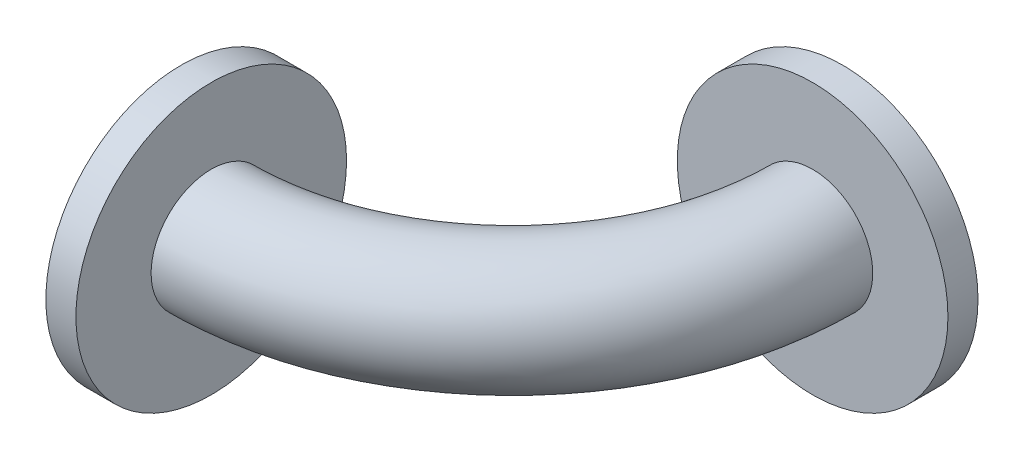
ISO-10303-21;
HEADER;
FILE_DESCRIPTION(('STEP AP214'),'2;1');
FILE_NAME('part.step','',(''),(''),'','','');
FILE_SCHEMA(('AUTOMOTIVE_DESIGN { 1 0 10303 214 1 1 1 1 }'));
ENDSEC;
DATA;
#1=APPLICATION_CONTEXT('core data for automotive mechanical design processes');
#2=APPLICATION_PROTOCOL_DEFINITION('international standard','automotive_design',2000,#1);
#3=PRODUCT_CONTEXT('',#1,'mechanical');
#4=PRODUCT('Part','Part','',(#3));
#5=PRODUCT_RELATED_PRODUCT_CATEGORY('part','',(#4));
#6=PRODUCT_DEFINITION_FORMATION('','',#4);
#7=PRODUCT_DEFINITION_CONTEXT('part definition',#1,'design');
#8=PRODUCT_DEFINITION('design','',#6,#7);
#9=PRODUCT_DEFINITION_SHAPE('','',#8);
#10=(LENGTH_UNIT() NAMED_UNIT(*) SI_UNIT(.MILLI.,.METRE.));
#11=(NAMED_UNIT(*) PLANE_ANGLE_UNIT() SI_UNIT($,.RADIAN.));
#12=(NAMED_UNIT(*) SI_UNIT($,.STERADIAN.) SOLID_ANGLE_UNIT());
#13=UNCERTAINTY_MEASURE_WITH_UNIT(LENGTH_MEASURE(1.E-05),#10,'distance_accuracy_value','');
#14=(GEOMETRIC_REPRESENTATION_CONTEXT(3) GLOBAL_UNCERTAINTY_ASSIGNED_CONTEXT((#13)) GLOBAL_UNIT_ASSIGNED_CONTEXT((#10,
#11,#12)) REPRESENTATION_CONTEXT('',''));
#15=CARTESIAN_POINT('',(0.,0.,0.));
#16=DIRECTION('',(0.,0.,1.));
#17=DIRECTION('',(1.,0.,0.));
#18=AXIS2_PLACEMENT_3D('',#15,#16,#17);
#19=CARTESIAN_POINT('',(40.,0.,0.));
#20=DIRECTION('',(2.45418139062237E-06,0.,0.999999999996989));
#21=DIRECTION('',(0.999999999996989,0.,-2.45418139062237E-06));
#22=AXIS2_PLACEMENT_3D('',#19,#20,#21);
#23=PLANE('',#22);
#24=CARTESIAN_POINT('',(40.,0.,0.));
#25=DIRECTION('',(2.45418139062237E-06,0.,0.999999999996989));
#26=DIRECTION('',(0.999999999996989,0.,-2.45418139062237E-06));
#27=AXIS2_PLACEMENT_3D('',#24,#25,#26);
#28=CIRCLE('',#27,8.);
#29=CARTESIAN_POINT('',(40.0000000003982,8.,0.));
#30=VERTEX_POINT('',#29);
#31=CARTESIAN_POINT('',(40.0000000003982,-8.00000000000009,0.));
#32=VERTEX_POINT('',#31);
#33=EDGE_CURVE('E93',#30,#32,#28,.T.);
#34=ORIENTED_EDGE('',*,*,#33,.F.);
#35=DIRECTION('',(0.,-1.,0.));
#36=VECTOR('',#35,1.);
#37=CARTESIAN_POINT('',(40.0000000003982,0.,0.));
#38=LINE('',#37,#36);
#39=EDGE_CURVE('E124',#30,#32,#38,.T.);
#40=ORIENTED_EDGE('',*,*,#39,.T.);
#41=EDGE_LOOP('',(#34,#40));
#42=FACE_BOUND('',#41,.T.);
#43=ADVANCED_FACE('F57',(#42),#23,.F.);
#44=CARTESIAN_POINT('',(0.,0.,40.));
#45=DIRECTION('',(-0.999999999996989,0.,-2.45418138975396E-06));
#46=DIRECTION('',(-2.45418138975396E-06,0.,0.999999999996989));
#47=AXIS2_PLACEMENT_3D('',#44,#45,#46);
#48=PLANE('',#47);
#49=DIRECTION('',(0.,-1.,0.));
#50=VECTOR('',#49,1.);
#51=CARTESIAN_POINT('',(0.,0.,40.0000000115915));
#52=LINE('',#51,#50);
#53=CARTESIAN_POINT('',(0.,8.,40.0000000115915));
#54=VERTEX_POINT('',#53);
#55=CARTESIAN_POINT('',(0.,-8.,40.0000000115915));
#56=VERTEX_POINT('',#55);
#57=EDGE_CURVE('E95',#54,#56,#52,.T.);
#58=ORIENTED_EDGE('',*,*,#57,.F.);
#59=CARTESIAN_POINT('',(0.,0.,40.));
#60=DIRECTION('',(-0.999999999996989,0.,-2.45418138975396E-06));
#61=DIRECTION('',(-2.45418138975396E-06,0.,0.999999999996989));
#62=AXIS2_PLACEMENT_3D('',#59,#60,#61);
#63=CIRCLE('',#62,8.);
#64=EDGE_CURVE('E87',#54,#56,#63,.T.);
#65=ORIENTED_EDGE('',*,*,#64,.T.);
#66=EDGE_LOOP('',(#58,#65));
#67=FACE_BOUND('',#66,.T.);
#68=ADVANCED_FACE('F96',(#67),#48,.T.);
#69=CARTESIAN_POINT('',(9.8167014690731E-05,0.,9.81670147150171E-05));
#70=DIRECTION('',(0.,-1.,0.));
#71=DIRECTION('',(0.,0.,-1.));
#72=AXIS2_PLACEMENT_3D('',#69,#70,#71);
#73=TOROIDAL_SURFACE('',#72,39.9999018331058,8.);
#74=CARTESIAN_POINT('',(0.,-4.87386490187069,33.6560705458997));
#75=CARTESIAN_POINT('',(0.,-5.05210067986452,33.7930021128648));
#76=CARTESIAN_POINT('',(0.,-5.22454037301277,33.93743455006));
#77=CARTESIAN_POINT('',(0.,-5.55670460949417,34.2403509101367));
#78=CARTESIAN_POINT('',(0.,-5.71642579537593,34.3988385201396));
#79=CARTESIAN_POINT('',(0.,-6.02211615547664,34.7288740969469));
#80=CARTESIAN_POINT('',(0.,-6.16807044869761,34.9004358419699));
#81=CARTESIAN_POINT('',(0.,-6.44500070193682,35.2552543219032));
#82=CARTESIAN_POINT('',(0.,-6.57597648151313,35.4385111976601));
#83=CARTESIAN_POINT('',(0.,-6.82195373137965,35.8153201541457));
#84=CARTESIAN_POINT('',(0.,-6.93696303007021,36.0088671247813));
#85=CARTESIAN_POINT('',(0.,-7.15026773827632,36.4049659063379));
#86=CARTESIAN_POINT('',(0.,-7.24856288382728,36.6075178594098));
#87=CARTESIAN_POINT('',(0.,-7.42769941481079,37.0200944443589));
#88=CARTESIAN_POINT('',(0.,-7.50854828411153,37.2301158268856));
#89=CARTESIAN_POINT('',(0.,-7.65229627899845,37.6562952045535));
#90=CARTESIAN_POINT('',(0.,-7.71518918167146,37.8724552986925));
#91=CARTESIAN_POINT('',(0.,-7.82253660012108,38.3092888782651));
#92=CARTESIAN_POINT('',(0.,-7.86699251705515,38.5299620193824));
#93=CARTESIAN_POINT('',(0.,-7.93715738141301,38.9742723692672));
#94=CARTESIAN_POINT('',(0.,-7.96286603604761,39.1979096242719));
#95=CARTESIAN_POINT('',(0.,-7.99535279984939,39.6465595082686));
#96=CARTESIAN_POINT('',(0.,-8.00213052133435,39.8715721653326));
#97=CARTESIAN_POINT('',(0.,-7.99670605946939,40.3213735803066));
#98=CARTESIAN_POINT('',(0.,-7.9845034568547,40.546162333161));
#99=CARTESIAN_POINT('',(0.,-7.94120873632313,40.9938672581597));
#100=CARTESIAN_POINT('',(0.,-7.91012044932413,41.2167838007826));
#101=CARTESIAN_POINT('',(0.,-7.82926454708224,41.6592829475681));
#102=CARTESIAN_POINT('',(0.,-7.77949046832126,41.8788643707173));
#103=CARTESIAN_POINT('',(0.,-7.66162884225767,42.3130128267019));
#104=CARTESIAN_POINT('',(0.,-7.59354464521048,42.5275807690698));
#105=CARTESIAN_POINT('',(0.,-7.43954152212418,42.9502217361026));
#106=CARTESIAN_POINT('',(0.,-7.35362231846967,43.1582946596096));
#107=CARTESIAN_POINT('',(0.,-7.16456227963177,43.5664593117797));
#108=CARTESIAN_POINT('',(0.,-7.06142173594328,43.7665511754621));
#109=CARTESIAN_POINT('',(0.,-6.83864876892778,44.1573392806195));
#110=CARTESIAN_POINT('',(0.,-6.71901598113732,44.3480353143287));
#111=CARTESIAN_POINT('',(0.,-6.46413455596232,44.7186367277354));
#112=CARTESIAN_POINT('',(0.,-6.32888882632023,44.8985441072507));
#113=CARTESIAN_POINT('',(0.,-6.04367533925899,45.2463884196417));
#114=CARTESIAN_POINT('',(0.,-5.89370250082629,45.4143211864079));
#115=CARTESIAN_POINT('',(0.,-5.58016898425443,45.7369241766062));
#116=CARTESIAN_POINT('',(0.,-5.41661076312113,45.8915967879863));
#117=CARTESIAN_POINT('',(0.,-5.07704318322159,46.1866161119083));
#118=CARTESIAN_POINT('',(0.,-4.90103363065828,46.3269626013901));
#119=CARTESIAN_POINT('',(0.,-4.53782024105015,46.5923267594616));
#120=CARTESIAN_POINT('',(0.,-4.35061660306838,46.7173447005165));
#121=CARTESIAN_POINT('',(0.,-3.96633880728821,46.9511684850179));
#122=CARTESIAN_POINT('',(0.,-3.76926443141249,47.0599739700662));
#123=CARTESIAN_POINT('',(0.,-3.36668730515387,47.2605774444621));
#124=CARTESIAN_POINT('',(0.,-3.16118611618682,47.3523785673347));
#125=CARTESIAN_POINT('',(0.,-2.74310931508905,47.5183744555408));
#126=CARTESIAN_POINT('',(0.,-2.53053127820068,47.5925631139831));
#127=CARTESIAN_POINT('',(0.,-2.09991930514721,47.7227536440212));
#128=CARTESIAN_POINT('',(0.,-1.88188636480785,47.7787588094051));
#129=CARTESIAN_POINT('',(0.,-1.44187409960668,47.8722033455693));
#130=CARTESIAN_POINT('',(0.,-1.2198947133705,47.9096424273513));
#131=CARTESIAN_POINT('',(0.,-0.773575233401453,47.9656867841202));
#132=CARTESIAN_POINT('',(0.,-0.549235183882918,47.9842924112184));
#133=CARTESIAN_POINT('',(0.,-0.0997801717188068,48.0025390155998));
#134=CARTESIAN_POINT('',(0.,0.125334807944763,48.0021795737059));
#135=CARTESIAN_POINT('',(0.,0.574692807740358,47.9824993827279));
#136=CARTESIAN_POINT('',(0.,0.798935980788238,47.9631821248624));
#137=CARTESIAN_POINT('',(0.,1.24507582872741,47.9057187737457));
#138=CARTESIAN_POINT('',(0.,1.466971663712,47.8675661592095));
#139=CARTESIAN_POINT('',(0.,1.90668030863272,47.7727174819919));
#140=CARTESIAN_POINT('',(0.,2.12449456084579,47.7160281053194));
#141=CARTESIAN_POINT('',(0.,2.55465496137262,47.5844803750194));
#142=CARTESIAN_POINT('',(0.,2.76699903254769,47.5096152289709));
#143=CARTESIAN_POINT('',(0.,3.18453758165403,47.3422941411916));
#144=CARTESIAN_POINT('',(0.,3.38973498034003,47.24984548784));
#145=CARTESIAN_POINT('',(0.,3.79170553663474,47.0479484718072));
#146=CARTESIAN_POINT('',(0.,3.98847483461868,46.9384924246058));
#147=CARTESIAN_POINT('',(0.,4.372090736271,46.7033895326541));
#148=CARTESIAN_POINT('',(0.,4.55893733993937,46.5777426879038));
#149=CARTESIAN_POINT('',(0.,4.92129671662443,46.3112123606622));
#150=CARTESIAN_POINT('',(0.,5.09681458496351,46.1703358053813));
#151=CARTESIAN_POINT('',(0.,5.43543175369134,45.8742392004557));
#152=CARTESIAN_POINT('',(0.,5.59852588557164,45.7190132399904));
#153=CARTESIAN_POINT('',(0.,5.91099658848551,45.3954319745419));
#154=CARTESIAN_POINT('',(0.,6.06037826903506,45.2270816035565));
#155=CARTESIAN_POINT('',(0.,6.34448251696433,44.8783342160437));
#156=CARTESIAN_POINT('',(0.,6.47919978147381,44.6979328795111));
#157=CARTESIAN_POINT('',(0.,6.73291120626772,44.3264852875542));
#158=CARTESIAN_POINT('',(0.,6.85191079607015,44.1354427406253));
#159=CARTESIAN_POINT('',(0.,7.07341646173948,43.7439773373335));
#160=CARTESIAN_POINT('',(0.,7.1759194961817,43.543552760004));
#161=CARTESIAN_POINT('',(0.,7.36367468945894,43.1347854252901));
#162=CARTESIAN_POINT('',(0.,7.44892722952453,42.9264428430121));
#163=CARTESIAN_POINT('',(0.,7.60157963758989,42.5033124961469));
#164=CARTESIAN_POINT('',(0.,7.66897917177289,42.2885246111285));
#165=CARTESIAN_POINT('',(0.,7.78544338041088,41.8540378300018));
#166=CARTESIAN_POINT('',(0.,7.83450834023526,41.6343390103864));
#167=CARTESIAN_POINT('',(0.,7.91396326868696,41.1915488119916));
#168=CARTESIAN_POINT('',(0.,7.9443498503797,40.9684568254433));
#169=CARTESIAN_POINT('',(0.,7.98621068339751,40.5205834982875));
#170=CARTESIAN_POINT('',(0.,7.99769147687218,40.2958027691112));
#171=CARTESIAN_POINT('',(0.,8.00167985578289,39.8460315057326));
#172=CARTESIAN_POINT('',(0.,7.99418394035698,39.6210409404735));
#173=CARTESIAN_POINT('',(0.,7.96026518971409,39.1724960654786));
#174=CARTESIAN_POINT('',(0.,7.93384277283451,38.9489417241078));
#175=CARTESIAN_POINT('',(0.,7.8622586873341,38.5048495923561));
#176=CARTESIAN_POINT('',(0.,7.81709668557692,38.2843118556738));
#177=CARTESIAN_POINT('',(0.,7.7083553372131,37.8478283371265));
#178=CARTESIAN_POINT('',(0.,7.64477627733032,37.6318824838295));
#179=CARTESIAN_POINT('',(0.,7.49963940603014,37.2060759034566));
#180=CARTESIAN_POINT('',(0.,7.4180783515735,36.996216281763));
#181=CARTESIAN_POINT('',(0.,7.23759546175772,36.5841867617662));
#182=CARTESIAN_POINT('',(0.,7.13867964493372,36.3820142271016));
#183=CARTESIAN_POINT('',(0.,6.92415100228188,35.9866822020886));
#184=CARTESIAN_POINT('',(0.,6.80853507466104,35.793524394927));
#185=CARTESIAN_POINT('',(0.,6.5614447008135,35.4176394589188));
#186=CARTESIAN_POINT('',(0.,6.42997060515043,35.2349120996262));
#187=CARTESIAN_POINT('',(0.,6.1520941766772,34.8811794716914));
#188=CARTESIAN_POINT('',(0.,6.0056915912451,34.7101744014973));
#189=CARTESIAN_POINT('',(0.,5.69900329324549,34.3811080908476));
#190=CARTESIAN_POINT('',(0.,5.53871779682769,34.2230466489411));
#191=CARTESIAN_POINT('',(0.,5.20537068262974,33.9209606575617));
#192=CARTESIAN_POINT('',(0.,5.03230673368789,33.7769386804702));
#193=CARTESIAN_POINT('',(0.,4.67472137037065,33.504035987603));
#194=CARTESIAN_POINT('',(0.,4.49020394221087,33.3751500486153));
#195=CARTESIAN_POINT('',(0.,4.11093046068785,33.1333531112764));
#196=CARTESIAN_POINT('',(0.,3.91617233830542,33.0204453582826));
#197=CARTESIAN_POINT('',(0.,3.51784096222712,32.8114409264413));
#198=CARTESIAN_POINT('',(0.,3.31426790334609,32.7153438763045));
#199=CARTESIAN_POINT('',(0.,2.89975417231107,32.5406427743774));
#200=CARTESIAN_POINT('',(0.,2.68881365111791,32.4620383644022));
#201=CARTESIAN_POINT('',(0.,2.26106404024906,32.3228799453064));
#202=CARTESIAN_POINT('',(0.,2.04425504227498,32.2623256543097));
#203=CARTESIAN_POINT('',(0.,1.60628990766417,32.159692397743));
#204=CARTESIAN_POINT('',(0.,1.38513344182468,32.1176148369582));
#205=CARTESIAN_POINT('',(0.,0.940138970512868,32.0522522445757));
#206=CARTESIAN_POINT('',(0.,0.716301919402641,32.0289607153144));
#207=CARTESIAN_POINT('',(0.,0.267364819426949,32.0013054184598));
#208=CARTESIAN_POINT('',(0.,0.0422642688515124,31.9969497942595));
#209=CARTESIAN_POINT('',(0.,-0.407499756397993,32.0072194039169));
#210=CARTESIAN_POINT('',(0.,-0.632163237917867,32.0218443380459));
#211=CARTESIAN_POINT('',(0.,-1.07956965928534,32.0699825895294));
#212=CARTESIAN_POINT('',(0.,-1.30231159922407,32.1035052018871));
#213=CARTESIAN_POINT('',(0.,-1.74417349099226,32.189205770502));
#214=CARTESIAN_POINT('',(0.,-1.96329348641736,32.2413835020452));
#215=CARTESIAN_POINT('',(0.,-2.39612728332407,32.3639599372558));
#216=CARTESIAN_POINT('',(0.,-2.60984660714024,32.4343391271531));
#217=CARTESIAN_POINT('',(0.,-3.03053279585898,32.5928147777031));
#218=CARTESIAN_POINT('',(0.,-3.23750142216234,32.6809065730785));
#219=CARTESIAN_POINT('',(0.,-3.69382988862607,32.8982833959538));
#220=CARTESIAN_POINT('',(0.,-3.9409216845394,33.032364145574));
#221=CARTESIAN_POINT('',(0.,-4.41964388632812,33.3257538971382));
#222=CARTESIAN_POINT('',(0.,-4.65127429220352,33.4850628990822));
#223=CARTESIAN_POINT('',(0.,-4.87386490187069,33.6560705458997));
#224=B_SPLINE_CURVE_WITH_KNOTS('',3,(#74,#75,#76,#77,#78,#79,#80,#81,#82,#83,#84,#85,#86,#87,
#88,#89,#90,#91,#92,#93,#94,#95,#96,#97,#98,#99,#100,#101,#102,#103,#104,#105,#106,#107,#108,
#109,#110,#111,#112,#113,#114,#115,#116,#117,#118,#119,#120,#121,#122,#123,#124,#125,#126,#127,
#128,#129,#130,#131,#132,#133,#134,#135,#136,#137,#138,#139,#140,#141,#142,#143,#144,#145,#146,
#147,#148,#149,#150,#151,#152,#153,#154,#155,#156,#157,#158,#159,#160,#161,#162,#163,#164,#165,
#166,#167,#168,#169,#170,#171,#172,#173,#174,#175,#176,#177,#178,#179,#180,#181,#182,#183,#184,
#185,#186,#187,#188,#189,#190,#191,#192,#193,#194,#195,#196,#197,#198,#199,#200,#201,#202,#203,
#204,#205,#206,#207,#208,#209,#210,#211,#212,#213,#214,#215,#216,#217,#218,#219,#220,#221,#222,
#223),.UNSPECIFIED.,.T.,.F.,(4,2,2,2,2,2,2,2,2,2,2,2,2,2,2,2,2,2,2,2,2,2,2,2,2,2,2,2,2,2,2,2,2,
2,2,2,2,2,2,2,2,2,2,2,2,2,2,2,2,2,2,2,2,2,2,2,2,2,2,2,2,2,2,2,2,2,2,2,2,2,2,2,2,2,4),(0.,
0.674042747776209,1.34826284456399,2.02320356659461,2.69815241858984,3.37276916402868,
4.04739656261842,4.72173399081779,5.39630483800003,6.07082441035515,6.74535451693176,
7.41989843695429,8.09445725748754,8.76887929097649,9.44353482602768,10.1180670012883,
10.7926096769413,11.4671409361879,12.141687104346,12.8161078475953,13.4907620963908,
14.1652945940982,14.8398375927872,15.5143685997261,16.1889145158697,16.8633360042954,
17.537990999097,18.2125237175024,18.8870669353066,19.5615975415806,20.2361430567297,
20.9105643727616,21.5852193547392,22.2596312639163,22.9342955948747,23.6086808839317,
24.2833717741029,24.9580626642746,25.6324479533321,26.307112284291,26.9815241934686,
27.6561791754474,28.3306004914806,29.0051460066311,29.6796766129064,30.3542198307124,
31.0287525491197,31.7034075439232,32.3778290323507,33.0523749484962,33.7269059554369,
34.4014489541279,35.0759814518372,35.7506357006338,36.4250564438842,37.0996026120433,
37.7741338712911,38.4486765469436,39.1232087222037,39.7978642572543,40.4722862907428,
41.1468451112736,41.8213890312937,42.495919137868,43.1704387102207,43.845009557399,
44.5193469855944,45.1939743841802,45.8685911296151,46.5435399816045,47.2184807036294,
47.8927008004115,48.566743548182,49.4085250796904,50.2503066111987),.UNSPECIFIED.);
#225=EDGE_CURVE('E12',#56,#54,#224,.T.);
#226=ORIENTED_EDGE('',*,*,#225,.F.);
#227=ORIENTED_EDGE('',*,*,#64,.F.);
#228=EDGE_LOOP('',(#226,#227));
#229=FACE_BOUND('',#228,.T.);
#230=CARTESIAN_POINT('',(33.5301113255517,-4.70537358140101,0.));
#231=CARTESIAN_POINT('',(33.3979109948053,-4.52360086854655,0.));
#232=CARTESIAN_POINT('',(33.273392474898,-4.33627410888125,0.));
#233=CARTESIAN_POINT('',(33.0405272240324,-3.95174169654625,0.));
#234=CARTESIAN_POINT('',(32.9321847566926,-3.7545334575855,0.));
#235=CARTESIAN_POINT('',(32.7323856133086,-3.35148212026289,0.));
#236=CARTESIAN_POINT('',(32.6409471090387,-3.14563001801181,0.));
#237=CARTESIAN_POINT('',(32.4757457049724,-2.72694754291486,0.));
#238=CARTESIAN_POINT('',(32.4019830180999,-2.51411708604245,0.));
#239=CARTESIAN_POINT('',(32.2726923923591,-2.08310231688398,0.));
#240=CARTESIAN_POINT('',(32.2171554989967,-1.86492069047483,0.));
#241=CARTESIAN_POINT('',(32.1246606526146,-1.42465049311433,0.));
#242=CARTESIAN_POINT('',(32.0877029929965,-1.20256186052122,0.));
#243=CARTESIAN_POINT('',(32.0326426602717,-0.756156557081772,0.));
#244=CARTESIAN_POINT('',(32.0145318896853,-0.53184088492798,0.));
#245=CARTESIAN_POINT('',(31.9972629554397,-0.0824033120760999,0.));
#246=CARTESIAN_POINT('',(31.9981113543132,0.142718840817719,0.));
#247=CARTESIAN_POINT('',(32.018770077895,0.592074225370719,0.));
#248=CARTESIAN_POINT('',(32.0385789612827,0.816307523297041,0.));
#249=CARTESIAN_POINT('',(32.0970161845038,1.2623118799386,0.));
#250=CARTESIAN_POINT('',(32.1356448182428,1.48408290014544,0.));
#251=CARTESIAN_POINT('',(32.231448034722,1.92358699789736,0.));
#252=CARTESIAN_POINT('',(32.2886229972414,2.14131999265793,0.));
#253=CARTESIAN_POINT('',(32.421113639661,2.57120017057537,0.));
#254=CARTESIAN_POINT('',(32.4964297202574,2.78334723023677,0.));
#255=CARTESIAN_POINT('',(32.6646493487839,3.20049982733797,0.));
#256=CARTESIAN_POINT('',(32.7575493272303,3.40550680421228,0.));
#257=CARTESIAN_POINT('',(32.9603216109399,3.80703709296801,0.));
#258=CARTESIAN_POINT('',(33.0701997813057,4.00355744302061,0.));
#259=CARTESIAN_POINT('',(33.306101998241,4.38660625031942,0.));
#260=CARTESIAN_POINT('',(33.4321230888866,4.57313652799842,0.));
#261=CARTESIAN_POINT('',(33.6994330060294,4.9349206585622,0.));
#262=CARTESIAN_POINT('',(33.8407220701677,5.11017433586251,0.));
#263=CARTESIAN_POINT('',(34.1375593009714,5.4481532404886,0.));
#264=CARTESIAN_POINT('',(34.2931072262658,5.61087867980389,0.));
#265=CARTESIAN_POINT('',(34.617361992568,5.92265100778314,0.));
#266=CARTESIAN_POINT('',(34.7860691243464,6.07169759403573,0.));
#267=CARTESIAN_POINT('',(35.1354073066379,6.35502211275846,0.));
#268=CARTESIAN_POINT('',(35.3160361341884,6.48930278615451,0.));
#269=CARTESIAN_POINT('',(35.6880265564028,6.74221685188247,0.));
#270=CARTESIAN_POINT('',(35.8793918454332,6.86084481053945,0.));
#271=CARTESIAN_POINT('',(36.2714017174189,7.08153512651143,0.));
#272=CARTESIAN_POINT('',(36.4720446195596,7.18360046946455,0.));
#273=CARTESIAN_POINT('',(36.8812185640975,7.37046733629247,0.));
#274=CARTESIAN_POINT('',(37.089749729247,7.45526859138297,0.));
#275=CARTESIAN_POINT('',(37.5132109082556,7.60700102909113,0.));
#276=CARTESIAN_POINT('',(37.7281408082926,7.67393252936885,0.));
#277=CARTESIAN_POINT('',(38.1628798471703,7.78945289382675,0.));
#278=CARTESIAN_POINT('',(38.3826890937521,7.83804135254571,0.));
#279=CARTESIAN_POINT('',(38.8255785426244,7.91652085691131,0.));
#280=CARTESIAN_POINT('',(39.0486581340704,7.94641534985654,0.));
#281=CARTESIAN_POINT('',(39.4966201956902,7.98731569055493,0.));
#282=CARTESIAN_POINT('',(39.7215032633365,7.99831499486893,0.));
#283=CARTESIAN_POINT('',(40.1713556587264,8.0013262758304,0.));
#284=CARTESIAN_POINT('',(40.3963249634488,7.99334169343398,0.));
#285=CARTESIAN_POINT('',(40.8447947672728,7.95844885853961,0.));
#286=CARTESIAN_POINT('',(41.0682952434572,7.93154031148833,0.));
#287=CARTESIAN_POINT('',(41.5122306857344,7.85899121626036,0.));
#288=CARTESIAN_POINT('',(41.7326657090631,7.81335101831405,0.));
#289=CARTESIAN_POINT('',(42.1689122456896,7.70366188569228,0.));
#290=CARTESIAN_POINT('',(42.3847236566883,7.63961254415831,0.));
#291=CARTESIAN_POINT('',(42.8101443598583,7.49357437375526,0.));
#292=CARTESIAN_POINT('',(43.019754786664,7.41158885012372,0.));
#293=CARTESIAN_POINT('',(43.431396744187,7.23022264751031,0.));
#294=CARTESIAN_POINT('',(43.6334256238916,7.13083595149139,0.));
#295=CARTESIAN_POINT('',(44.028319703843,6.9154325401673,0.));
#296=CARTESIAN_POINT('',(44.221188179465,6.79942182942668,0.));
#297=CARTESIAN_POINT('',(44.5965389596448,6.55152151206202,0.));
#298=CARTESIAN_POINT('',(44.7790173498032,6.41962597846855,0.));
#299=CARTESIAN_POINT('',(45.132138820385,6.14098640227344,0.));
#300=CARTESIAN_POINT('',(45.3027867646895,5.99424852359411,0.));
#301=CARTESIAN_POINT('',(45.6311920682257,5.68685189084967,0.));
#302=CARTESIAN_POINT('',(45.788943550981,5.52618685860182,0.));
#303=CARTESIAN_POINT('',(46.0903476407412,5.19213580788903,0.));
#304=CARTESIAN_POINT('',(46.2340002477462,5.01874978942411,0.));
#305=CARTESIAN_POINT('',(46.5061231463361,4.66057125674048,0.));
#306=CARTESIAN_POINT('',(46.6346002852757,4.47578394466439,0.));
#307=CARTESIAN_POINT('',(46.8755845982894,4.09596642625805,0.));
#308=CARTESIAN_POINT('',(46.9880851424394,3.90093201333962,0.));
#309=CARTESIAN_POINT('',(47.1962139594195,3.5021524112127,0.));
#310=CARTESIAN_POINT('',(47.2918485291647,3.29841050839275,0.));
#311=CARTESIAN_POINT('',(47.4656487217563,2.88352081577062,0.));
#312=CARTESIAN_POINT('',(47.5438080359889,2.6723703831917,0.));
#313=CARTESIAN_POINT('',(47.682033888734,2.24430915594248,0.));
#314=CARTESIAN_POINT('',(47.7421066842819,2.02740038169577,0.));
#315=CARTESIAN_POINT('',(47.8437784493118,1.58925340396637,0.));
#316=CARTESIAN_POINT('',(47.8853740146801,1.368014410547,0.));
#317=CARTESIAN_POINT('',(47.9497786792413,0.922823680955597,0.));
#318=CARTESIAN_POINT('',(47.9725881936344,0.698872004848971,0.));
#319=CARTESIAN_POINT('',(47.999260398035,0.249838997556886,0.));
#320=CARTESIAN_POINT('',(48.0031227337906,0.0247576453288379,0.));
#321=CARTESIAN_POINT('',(47.9918722536386,-0.424926801324655,0.));
#322=CARTESIAN_POINT('',(47.9767597330819,-0.649529903139746,0.));
#323=CARTESIAN_POINT('',(47.9276630141451,-1.09670521287578,0.));
#324=CARTESIAN_POINT('',(47.8936753952846,-1.31927704526434,0.));
#325=CARTESIAN_POINT('',(47.8070828268476,-1.76068906776514,0.));
#326=CARTESIAN_POINT('',(47.7544843250293,-1.97953052278187,0.));
#327=CARTESIAN_POINT('',(47.6310302944629,-2.41204549230552,0.));
#328=CARTESIAN_POINT('',(47.5601713991664,-2.62571804590172,0.));
#329=CARTESIAN_POINT('',(47.4007067913889,-3.04632953575057,0.));
#330=CARTESIAN_POINT('',(47.3121014711931,-3.25326862072914,0.));
#331=CARTESIAN_POINT('',(47.1177712134343,-3.65895058199596,0.));
#332=CARTESIAN_POINT('',(47.0120459715484,-3.85769331250736,0.));
#333=CARTESIAN_POINT('',(46.7842304376213,-4.24556265301521,0.));
#334=CARTESIAN_POINT('',(46.6621404003694,-4.43468941266292,0.));
#335=CARTESIAN_POINT('',(46.4024384889448,-4.80201879142152,0.));
#336=CARTESIAN_POINT('',(46.2648238171049,-4.98021943259631,0.));
#337=CARTESIAN_POINT('',(45.9751194268208,-5.32433244471903,0.));
#338=CARTESIAN_POINT('',(45.8230347348411,-5.49024904743052,0.));
#339=CARTESIAN_POINT('',(45.5054014261828,-5.8087125928273,0.));
#340=CARTESIAN_POINT('',(45.3398503108206,-5.96125704336129,0.));
#341=CARTESIAN_POINT('',(44.996489543334,-6.25185387974127,0.));
#342=CARTESIAN_POINT('',(44.8186801622303,-6.38990658581832,0.));
#343=CARTESIAN_POINT('',(44.4520605711064,-6.6505445664896,0.));
#344=CARTESIAN_POINT('',(44.2632501749488,-6.77312957925881,0.));
#345=CARTESIAN_POINT('',(43.8759766797419,-7.00195612676333,0.));
#346=CARTESIAN_POINT('',(43.6775137309991,-7.10819791588269,0.));
#347=CARTESIAN_POINT('',(43.2723062086075,-7.30360290181496,0.));
#348=CARTESIAN_POINT('',(43.0655601270364,-7.39276297170749,0.));
#349=CARTESIAN_POINT('',(42.6453636151728,-7.55331845510387,0.));
#350=CARTESIAN_POINT('',(42.4319155300538,-7.62472000636135,0.));
#351=CARTESIAN_POINT('',(41.9997199500655,-7.74930376666313,0.));
#352=CARTESIAN_POINT('',(41.7809713891444,-7.80248227750245,0.));
#353=CARTESIAN_POINT('',(41.3397767792194,-7.8902208315777,0.));
#354=CARTESIAN_POINT('',(41.117330811997,-7.92478128605601,0.));
#355=CARTESIAN_POINT('',(40.6703227140533,-7.97503930635448,0.));
#356=CARTESIAN_POINT('',(40.4457606267606,-7.99073725843819,0.));
#357=CARTESIAN_POINT('',(39.9961157957824,-8.00315986600317,0.));
#358=CARTESIAN_POINT('',(39.7710330602829,-7.99988481778898,0.));
#359=CARTESIAN_POINT('',(39.3219264204881,-7.97438441422185,0.));
#360=CARTESIAN_POINT('',(39.0979025979825,-7.95215761834584,0.));
#361=CARTESIAN_POINT('',(38.652601064312,-7.88892082450905,0.));
#362=CARTESIAN_POINT('',(38.4313224297448,-7.84791732868393,0.));
#363=CARTESIAN_POINT('',(37.9929100982089,-7.74739885904297,0.));
#364=CARTESIAN_POINT('',(37.7757782245118,-7.68787593272803,0.));
#365=CARTESIAN_POINT('',(37.3473050213571,-7.55074877468681,0.));
#366=CARTESIAN_POINT('',(37.1359636005141,-7.47314482850022,0.));
#367=CARTESIAN_POINT('',(36.7204679611851,-7.30036412691873,0.));
#368=CARTESIAN_POINT('',(36.5163173320996,-7.20517873942637,0.));
#369=CARTESIAN_POINT('',(36.1167692269318,-6.99794015585875,0.));
#370=CARTESIAN_POINT('',(35.9213716454447,-6.8858871629752,0.));
#371=CARTESIAN_POINT('',(35.5409179881767,-6.6458348918146,0.));
#372=CARTESIAN_POINT('',(35.3558510936519,-6.51785276690999,0.));
#373=CARTESIAN_POINT('',(34.9972075041508,-6.24680631902677,0.));
#374=CARTESIAN_POINT('',(34.8236277995607,-6.10374597217311,0.));
#375=CARTESIAN_POINT('',(34.447467114889,-5.7661197117216,0.));
#376=CARTESIAN_POINT('',(34.2484185965395,-5.56759593386645,0.));
#377=CARTESIAN_POINT('',(33.8722902117148,-5.15072673261039,0.));
#378=CARTESIAN_POINT('',(33.6952103452396,-4.93238130920948,0.));
#379=CARTESIAN_POINT('',(33.5301113255517,-4.70537358140101,0.));
#380=B_SPLINE_CURVE_WITH_KNOTS('',3,(#230,#231,#232,#233,#234,#235,#236,#237,#238,#239,#240,
#241,#242,#243,#244,#245,#246,#247,#248,#249,#250,#251,#252,#253,#254,#255,#256,#257,#258,#259,
#260,#261,#262,#263,#264,#265,#266,#267,#268,#269,#270,#271,#272,#273,#274,#275,#276,#277,#278,
#279,#280,#281,#282,#283,#284,#285,#286,#287,#288,#289,#290,#291,#292,#293,#294,#295,#296,#297,
#298,#299,#300,#301,#302,#303,#304,#305,#306,#307,#308,#309,#310,#311,#312,#313,#314,#315,#316,
#317,#318,#319,#320,#321,#322,#323,#324,#325,#326,#327,#328,#329,#330,#331,#332,#333,#334,#335,
#336,#337,#338,#339,#340,#341,#342,#343,#344,#345,#346,#347,#348,#349,#350,#351,#352,#353,#354,
#355,#356,#357,#358,#359,#360,#361,#362,#363,#364,#365,#366,#367,#368,#369,#370,#371,#372,#373,
#374,#375,#376,#377,#378,#379),.UNSPECIFIED.,.T.,.F.,(4,2,2,2,2,2,2,2,2,2,2,2,2,2,2,2,2,2,2,2,2,
2,2,2,2,2,2,2,2,2,2,2,2,2,2,2,2,2,2,2,2,2,2,2,2,2,2,2,2,2,2,2,2,2,2,2,2,2,2,2,2,2,2,2,2,2,2,2,2,
2,2,2,2,2,4),(0.,0.674042747772038,1.34826284455564,2.02320356658201,2.69815241857299,
3.37276916400779,4.04739656259347,4.7217339907888,5.39630483796699,6.07082441031531,
6.74535451688512,7.41989843690082,8.09445725742727,8.76887929090938,9.44353482595374,
10.1180670012075,10.7926096768537,11.4671409360969,12.1416871042515,12.8161078474973,
13.4907620962894,14.1652945939978,14.8398375926878,15.5143685996276,16.1889145157722,
16.8633360042019,17.5379909990077,18.2125237174172,18.8870669352255,19.5615975415046,
20.2361430566589,20.910564372696,21.5852193546786,22.25963126386,22.9342955948226,
23.608680883884,24.2833717740594,24.9580626642332,25.6324479532929,26.3071122842539,
26.9815241934336,27.6561791754119,28.3306004914446,29.0051460065946,29.6796766128694,
30.3542198306724,31.0287525490766,31.7034075438771,32.3778290323016,33.0523749484423,
33.7269059553782,34.4014489540644,35.0759814517689,35.7506357005605,36.4250564438059,
37.09960261196,37.7741338712028,38.4486765468521,39.1232087221091,39.7978642571566,
40.4722862906419,41.1468451111734,41.8213890311942,42.4959191377691,43.1704387101225,
43.8450095573057,44.5193469855062,45.193974384097,45.8685911295369,46.5435399815337,
47.2184807035659,47.8927008003552,48.5667435481331,49.4085250796659,50.2503066111987),.UNSPECIFIED.);
#381=EDGE_CURVE('E72',#30,#32,#380,.T.);
#382=ORIENTED_EDGE('',*,*,#381,.F.);
#383=ORIENTED_EDGE('',*,*,#33,.T.);
#384=EDGE_LOOP('',(#382,#383));
#385=FACE_BOUND('',#384,.T.);
#386=ADVANCED_FACE('F89',(#229,#385),#73,.T.);
#387=CARTESIAN_POINT('',(40.,0.,0.));
#388=DIRECTION('',(0.,0.,1.));
#389=DIRECTION('',(1.,0.,0.));
#390=AXIS2_PLACEMENT_3D('',#387,#388,#389);
#391=PLANE('',#390);
#392=CARTESIAN_POINT('',(40.,0.,0.));
#393=DIRECTION('',(0.,0.,1.));
#394=DIRECTION('',(1.,0.,0.));
#395=AXIS2_PLACEMENT_3D('',#392,#393,#394);
#396=CIRCLE('',#395,18.);
#397=CARTESIAN_POINT('',(58.,0.,0.));
#398=VERTEX_POINT('',#397);
#399=EDGE_CURVE('E99',#398,#398,#396,.T.);
#400=ORIENTED_EDGE('',*,*,#399,.T.);
#401=EDGE_LOOP('',(#400));
#402=FACE_BOUND('',#401,.T.);
#403=ORIENTED_EDGE('',*,*,#39,.F.);
#404=ORIENTED_EDGE('',*,*,#381,.T.);
#405=EDGE_LOOP('',(#403,#404));
#406=FACE_BOUND('',#405,.T.);
#407=ADVANCED_FACE('F148',(#402,#406),#391,.T.);
#408=CARTESIAN_POINT('',(40.,0.,-4.));
#409=DIRECTION('',(0.,0.,1.));
#410=DIRECTION('',(1.,0.,0.));
#411=AXIS2_PLACEMENT_3D('',#408,#409,#410);
#412=CYLINDRICAL_SURFACE('',#411,18.);
#413=CARTESIAN_POINT('',(40.,0.,-4.));
#414=DIRECTION('',(0.,0.,1.));
#415=DIRECTION('',(1.,0.,0.));
#416=AXIS2_PLACEMENT_3D('',#413,#414,#415);
#417=CIRCLE('',#416,18.);
#418=CARTESIAN_POINT('',(58.,0.,-4.));
#419=VERTEX_POINT('',#418);
#420=EDGE_CURVE('E120',#419,#419,#417,.T.);
#421=ORIENTED_EDGE('',*,*,#420,.T.);
#422=EDGE_LOOP('',(#421));
#423=FACE_BOUND('',#422,.T.);
#424=ORIENTED_EDGE('',*,*,#399,.F.);
#425=EDGE_LOOP('',(#424));
#426=FACE_BOUND('',#425,.T.);
#427=ADVANCED_FACE('F153',(#423,#426),#412,.T.);
#428=CARTESIAN_POINT('',(40.,0.,-4.));
#429=DIRECTION('',(0.,0.,1.));
#430=DIRECTION('',(1.,0.,0.));
#431=AXIS2_PLACEMENT_3D('',#428,#429,#430);
#432=PLANE('',#431);
#433=ORIENTED_EDGE('',*,*,#420,.F.);
#434=EDGE_LOOP('',(#433));
#435=FACE_BOUND('',#434,.T.);
#436=ADVANCED_FACE('F156',(#435),#432,.F.);
#437=CARTESIAN_POINT('',(-4.,0.,40.));
#438=DIRECTION('',(1.,0.,0.));
#439=DIRECTION('',(0.,0.,-1.));
#440=AXIS2_PLACEMENT_3D('',#437,#438,#439);
#441=CYLINDRICAL_SURFACE('',#440,18.);
#442=CARTESIAN_POINT('',(-4.,0.,40.));
#443=DIRECTION('',(1.,0.,0.));
#444=DIRECTION('',(0.,0.,-1.));
#445=AXIS2_PLACEMENT_3D('',#442,#443,#444);
#446=CIRCLE('',#445,18.);
#447=CARTESIAN_POINT('',(-4.,0.,22.));
#448=VERTEX_POINT('',#447);
#449=EDGE_CURVE('E100',#448,#448,#446,.T.);
#450=ORIENTED_EDGE('',*,*,#449,.T.);
#451=EDGE_LOOP('',(#450));
#452=FACE_BOUND('',#451,.T.);
#453=CARTESIAN_POINT('',(0.,0.,40.));
#454=DIRECTION('',(1.,0.,0.));
#455=DIRECTION('',(0.,0.,-1.));
#456=AXIS2_PLACEMENT_3D('',#453,#454,#455);
#457=CIRCLE('',#456,18.);
#458=CARTESIAN_POINT('',(0.,0.,22.));
#459=VERTEX_POINT('',#458);
#460=EDGE_CURVE('E108',#459,#459,#457,.T.);
#461=ORIENTED_EDGE('',*,*,#460,.F.);
#462=EDGE_LOOP('',(#461));
#463=FACE_BOUND('',#462,.T.);
#464=ADVANCED_FACE('F162',(#452,#463),#441,.T.);
#465=CARTESIAN_POINT('',(-4.,0.,40.));
#466=DIRECTION('',(1.,0.,0.));
#467=DIRECTION('',(0.,0.,-1.));
#468=AXIS2_PLACEMENT_3D('',#465,#466,#467);
#469=PLANE('',#468);
#470=ORIENTED_EDGE('',*,*,#449,.F.);
#471=EDGE_LOOP('',(#470));
#472=FACE_BOUND('',#471,.T.);
#473=ADVANCED_FACE('F105',(#472),#469,.F.);
#474=CARTESIAN_POINT('',(0.,0.,40.));
#475=DIRECTION('',(1.,0.,0.));
#476=DIRECTION('',(0.,0.,-1.));
#477=AXIS2_PLACEMENT_3D('',#474,#475,#476);
#478=PLANE('',#477);
#479=ORIENTED_EDGE('',*,*,#225,.T.);
#480=ORIENTED_EDGE('',*,*,#57,.T.);
#481=EDGE_LOOP('',(#479,#480));
#482=FACE_BOUND('',#481,.T.);
#483=ORIENTED_EDGE('',*,*,#460,.T.);
#484=EDGE_LOOP('',(#483));
#485=FACE_BOUND('',#484,.T.);
#486=ADVANCED_FACE('F102',(#482,#485),#478,.T.);
#487=CLOSED_SHELL('',(#43,#68,#386,#407,#427,#436,#464,#473,#486));
#488=MANIFOLD_SOLID_BREP('B2',#487);
#489=ADVANCED_BREP_SHAPE_REPRESENTATION('',(#18,#488),#14);
#490=SHAPE_DEFINITION_REPRESENTATION(#9,#489);
ENDSEC;
END-ISO-10303-21;
